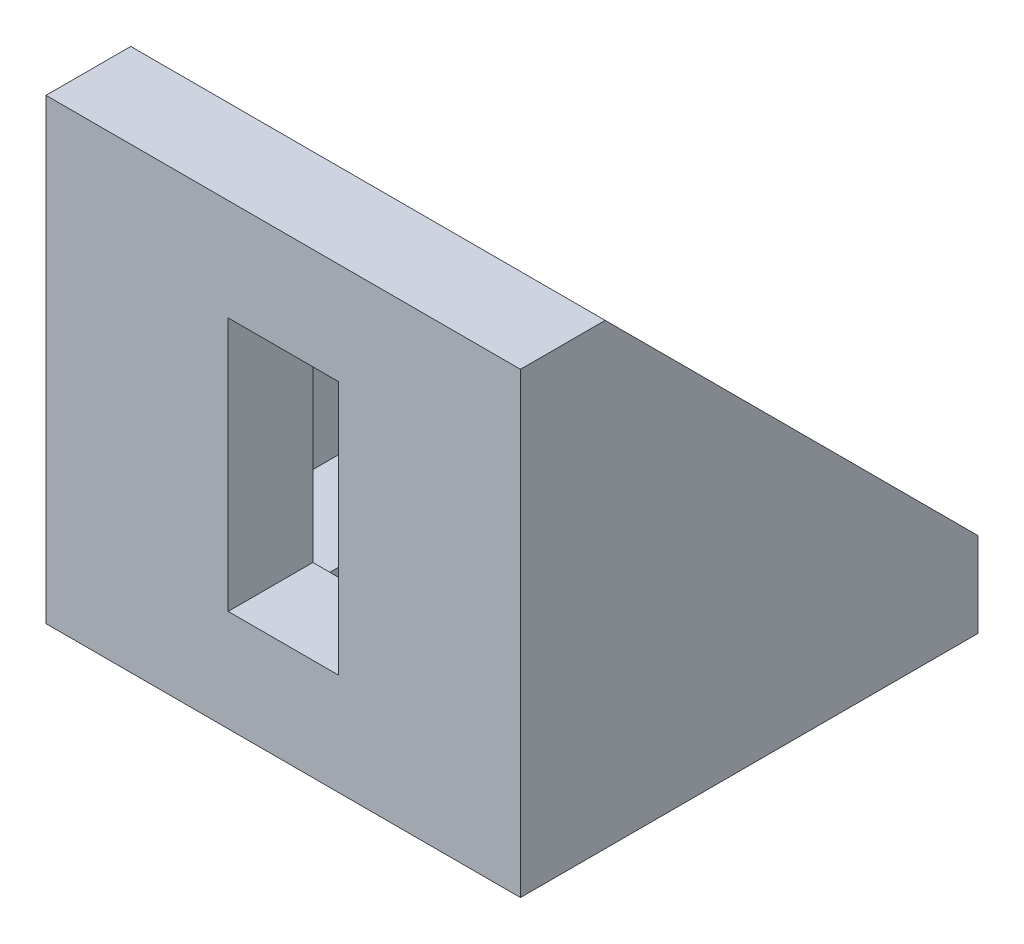
ISO-10303-21;
HEADER;
FILE_DESCRIPTION(('STEP AP214'),'2;1');
FILE_NAME('part.step','',(''),(''),'','','');
FILE_SCHEMA(('AUTOMOTIVE_DESIGN { 1 0 10303 214 1 1 1 1 }'));
ENDSEC;
DATA;
#1=APPLICATION_CONTEXT('core data for automotive mechanical design processes');
#2=APPLICATION_PROTOCOL_DEFINITION('international standard','automotive_design',2000,#1);
#3=PRODUCT_CONTEXT('',#1,'mechanical');
#4=PRODUCT('Part','Part','',(#3));
#5=PRODUCT_RELATED_PRODUCT_CATEGORY('part','',(#4));
#6=PRODUCT_DEFINITION_FORMATION('','',#4);
#7=PRODUCT_DEFINITION_CONTEXT('part definition',#1,'design');
#8=PRODUCT_DEFINITION('design','',#6,#7);
#9=PRODUCT_DEFINITION_SHAPE('','',#8);
#10=(LENGTH_UNIT() NAMED_UNIT(*) SI_UNIT(.MILLI.,.METRE.));
#11=(NAMED_UNIT(*) PLANE_ANGLE_UNIT() SI_UNIT($,.RADIAN.));
#12=(NAMED_UNIT(*) SI_UNIT($,.STERADIAN.) SOLID_ANGLE_UNIT());
#13=UNCERTAINTY_MEASURE_WITH_UNIT(LENGTH_MEASURE(1.E-05),#10,'distance_accuracy_value','');
#14=(GEOMETRIC_REPRESENTATION_CONTEXT(3) GLOBAL_UNCERTAINTY_ASSIGNED_CONTEXT((#13)) GLOBAL_UNIT_ASSIGNED_CONTEXT((#10,
#11,#12)) REPRESENTATION_CONTEXT('',''));
#15=CARTESIAN_POINT('',(0.,0.,0.));
#16=DIRECTION('',(0.,0.,1.));
#17=DIRECTION('',(1.,0.,0.));
#18=AXIS2_PLACEMENT_3D('',#15,#16,#17);
#19=CARTESIAN_POINT('',(9.33333333333333,3.33333333333333,-18.));
#20=DIRECTION('',(0.,-0.707106781186544,0.707106781186551));
#21=DIRECTION('',(0.,-0.707106781186551,-0.707106781186544));
#22=AXIS2_PLACEMENT_3D('',#19,#20,#21);
#23=PLANE('',#22);
#24=DIRECTION('',(-1.,0.,0.));
#25=VECTOR('',#24,1.);
#26=CARTESIAN_POINT('',(9.33333333333333,3.33333333333333,-18.));
#27=LINE('',#26,#25);
#28=CARTESIAN_POINT('',(9.33333333333333,3.33333333333333,-18.));
#29=VERTEX_POINT('',#28);
#30=CARTESIAN_POINT('',(6.,3.33333333333333,-18.));
#31=VERTEX_POINT('',#30);
#32=EDGE_CURVE('E308',#29,#31,#27,.T.);
#33=ORIENTED_EDGE('',*,*,#32,.T.);
#34=DIRECTION('',(0.,0.707106781186551,0.707106781186544));
#35=VECTOR('',#34,1.);
#36=CARTESIAN_POINT('',(6.,3.33333333333333,-18.));
#37=LINE('',#36,#35);
#38=CARTESIAN_POINT('',(6.,18.,-3.33333333333351));
#39=VERTEX_POINT('',#38);
#40=EDGE_CURVE('E320',#31,#39,#37,.T.);
#41=ORIENTED_EDGE('',*,*,#40,.T.);
#42=DIRECTION('',(-1.,0.,0.));
#43=VECTOR('',#42,1.);
#44=CARTESIAN_POINT('',(9.33333333333333,18.,-3.33333333333351));
#45=LINE('',#44,#43);
#46=CARTESIAN_POINT('',(9.33333333333333,18.,-3.33333333333351));
#47=VERTEX_POINT('',#46);
#48=EDGE_CURVE('E228',#47,#39,#45,.T.);
#49=ORIENTED_EDGE('',*,*,#48,.F.);
#50=DIRECTION('',(0.,0.707106781186551,0.707106781186544));
#51=VECTOR('',#50,1.);
#52=CARTESIAN_POINT('',(9.33333333333333,3.33333333333333,-18.));
#53=LINE('',#52,#51);
#54=EDGE_CURVE('E296',#29,#47,#53,.T.);
#55=ORIENTED_EDGE('',*,*,#54,.F.);
#56=EDGE_LOOP('',(#33,#41,#49,#55));
#57=FACE_BOUND('',#56,.T.);
#58=ADVANCED_FACE('F39',(#57),#23,.F.);
#59=CARTESIAN_POINT('',(9.33333333333333,0.,0.));
#60=DIRECTION('',(0.,1.,0.));
#61=DIRECTION('',(0.,0.,1.));
#62=AXIS2_PLACEMENT_3D('',#59,#60,#61);
#63=PLANE('',#62);
#64=DIRECTION('',(-1.,0.,0.));
#65=VECTOR('',#64,1.);
#66=CARTESIAN_POINT('',(2.16666666666667,0.,-4.));
#67=LINE('',#66,#65);
#68=CARTESIAN_POINT('',(2.16666666666667,0.,-4.));
#69=VERTEX_POINT('',#68);
#70=CARTESIAN_POINT('',(-2.16666666666667,0.,-4.));
#71=VERTEX_POINT('',#70);
#72=EDGE_CURVE('E255',#69,#71,#67,.T.);
#73=ORIENTED_EDGE('',*,*,#72,.F.);
#74=DIRECTION('',(0.,0.,1.));
#75=VECTOR('',#74,1.);
#76=CARTESIAN_POINT('',(2.16666666666667,0.,-14.));
#77=LINE('',#76,#75);
#78=CARTESIAN_POINT('',(2.16666666666667,0.,-14.));
#79=VERTEX_POINT('',#78);
#80=EDGE_CURVE('E55',#79,#69,#77,.T.);
#81=ORIENTED_EDGE('',*,*,#80,.F.);
#82=DIRECTION('',(1.,0.,0.));
#83=VECTOR('',#82,1.);
#84=CARTESIAN_POINT('',(2.16666666666667,0.,-14.));
#85=LINE('',#84,#83);
#86=CARTESIAN_POINT('',(-2.16666666666667,0.,-14.));
#87=VERTEX_POINT('',#86);
#88=EDGE_CURVE('E262',#87,#79,#85,.T.);
#89=ORIENTED_EDGE('',*,*,#88,.F.);
#90=DIRECTION('',(0.,0.,-1.));
#91=VECTOR('',#90,1.);
#92=CARTESIAN_POINT('',(-2.16666666666667,0.,-14.));
#93=LINE('',#92,#91);
#94=EDGE_CURVE('E258',#71,#87,#93,.T.);
#95=ORIENTED_EDGE('',*,*,#94,.F.);
#96=EDGE_LOOP('',(#73,#81,#89,#95));
#97=FACE_BOUND('',#96,.T.);
#98=DIRECTION('',(0.,0.,-1.));
#99=VECTOR('',#98,1.);
#100=CARTESIAN_POINT('',(-9.33333333333333,0.,0.));
#101=LINE('',#100,#99);
#102=CARTESIAN_POINT('',(-9.33333333333333,0.,0.));
#103=VERTEX_POINT('',#102);
#104=CARTESIAN_POINT('',(-9.33333333333333,0.,-18.));
#105=VERTEX_POINT('',#104);
#106=EDGE_CURVE('E288',#103,#105,#101,.T.);
#107=ORIENTED_EDGE('',*,*,#106,.T.);
#108=DIRECTION('',(-1.,0.,0.));
#109=VECTOR('',#108,1.);
#110=CARTESIAN_POINT('',(9.33333333333333,0.,-18.));
#111=LINE('',#110,#109);
#112=CARTESIAN_POINT('',(9.33333333333333,0.,-18.));
#113=VERTEX_POINT('',#112);
#114=EDGE_CURVE('E312',#113,#105,#111,.T.);
#115=ORIENTED_EDGE('',*,*,#114,.F.);
#116=DIRECTION('',(0.,0.,-1.));
#117=VECTOR('',#116,1.);
#118=CARTESIAN_POINT('',(9.33333333333333,0.,0.));
#119=LINE('',#118,#117);
#120=CARTESIAN_POINT('',(9.33333333333333,0.,0.));
#121=VERTEX_POINT('',#120);
#122=EDGE_CURVE('E289',#121,#113,#119,.T.);
#123=ORIENTED_EDGE('',*,*,#122,.F.);
#124=DIRECTION('',(-1.,0.,0.));
#125=VECTOR('',#124,1.);
#126=CARTESIAN_POINT('',(9.33333333333333,0.,0.));
#127=LINE('',#126,#125);
#128=EDGE_CURVE('E236',#121,#103,#127,.T.);
#129=ORIENTED_EDGE('',*,*,#128,.T.);
#130=EDGE_LOOP('',(#107,#115,#123,#129));
#131=FACE_BOUND('',#130,.T.);
#132=ADVANCED_FACE('F41',(#97,#131),#63,.F.);
#133=CARTESIAN_POINT('',(9.33333333333333,0.,-18.));
#134=DIRECTION('',(0.,0.,1.));
#135=DIRECTION('',(1.,0.,0.));
#136=AXIS2_PLACEMENT_3D('',#133,#134,#135);
#137=PLANE('',#136);
#138=DIRECTION('',(0.,1.,0.));
#139=VECTOR('',#138,1.);
#140=CARTESIAN_POINT('',(-9.33333333333333,0.,-18.));
#141=LINE('',#140,#139);
#142=CARTESIAN_POINT('',(-9.33333333333333,3.33333333333333,-18.));
#143=VERTEX_POINT('',#142);
#144=EDGE_CURVE('E302',#105,#143,#141,.T.);
#145=ORIENTED_EDGE('',*,*,#144,.T.);
#146=CARTESIAN_POINT('',(-6.,3.33333333333333,-18.));
#147=VERTEX_POINT('',#146);
#148=EDGE_CURVE('E299',#147,#143,#27,.T.);
#149=ORIENTED_EDGE('',*,*,#148,.F.);
#150=DIRECTION('',(1.,0.,0.));
#151=VECTOR('',#150,1.);
#152=CARTESIAN_POINT('',(6.,3.33333333333333,-18.));
#153=LINE('',#152,#151);
#154=EDGE_CURVE('E284',#147,#31,#153,.T.);
#155=ORIENTED_EDGE('',*,*,#154,.T.);
#156=ORIENTED_EDGE('',*,*,#32,.F.);
#157=DIRECTION('',(0.,1.,0.));
#158=VECTOR('',#157,1.);
#159=CARTESIAN_POINT('',(9.33333333333333,0.,-18.));
#160=LINE('',#159,#158);
#161=EDGE_CURVE('E292',#113,#29,#160,.T.);
#162=ORIENTED_EDGE('',*,*,#161,.F.);
#163=ORIENTED_EDGE('',*,*,#114,.T.);
#164=EDGE_LOOP('',(#145,#149,#155,#156,#162,#163));
#165=FACE_BOUND('',#164,.T.);
#166=ADVANCED_FACE('F365',(#165),#137,.F.);
#167=DIRECTION('',(0.,0.707106781186551,0.707106781186544));
#168=VECTOR('',#167,1.);
#169=CARTESIAN_POINT('',(-9.33333333333333,3.33333333333333,-18.));
#170=LINE('',#169,#168);
#171=CARTESIAN_POINT('',(-9.33333333333333,18.,-3.33333333333351));
#172=VERTEX_POINT('',#171);
#173=EDGE_CURVE('E293',#143,#172,#170,.T.);
#174=ORIENTED_EDGE('',*,*,#173,.T.);
#175=CARTESIAN_POINT('',(-6.,18.,-3.33333333333351));
#176=VERTEX_POINT('',#175);
#177=EDGE_CURVE('E221',#176,#172,#45,.T.);
#178=ORIENTED_EDGE('',*,*,#177,.F.);
#179=DIRECTION('',(0.,-0.707106781186551,-0.707106781186544));
#180=VECTOR('',#179,1.);
#181=CARTESIAN_POINT('',(-6.,3.33333333333334,-18.));
#182=LINE('',#181,#180);
#183=EDGE_CURVE('E316',#176,#147,#182,.T.);
#184=ORIENTED_EDGE('',*,*,#183,.T.);
#185=ORIENTED_EDGE('',*,*,#148,.T.);
#186=EDGE_LOOP('',(#174,#178,#184,#185));
#187=FACE_BOUND('',#186,.T.);
#188=ADVANCED_FACE('F361',(#187),#23,.F.);
#189=CARTESIAN_POINT('',(9.33333333333333,0.,0.));
#190=DIRECTION('',(-1.,0.,0.));
#191=DIRECTION('',(0.,0.,1.));
#192=AXIS2_PLACEMENT_3D('',#189,#190,#191);
#193=PLANE('',#192);
#194=ORIENTED_EDGE('',*,*,#54,.T.);
#195=DIRECTION('',(0.,0.,-1.));
#196=VECTOR('',#195,1.);
#197=CARTESIAN_POINT('',(9.33333333333333,18.,-1.7785772854495E-13));
#198=LINE('',#197,#196);
#199=CARTESIAN_POINT('',(9.33333333333333,18.,-1.7785772854495E-13));
#200=VERTEX_POINT('',#199);
#201=EDGE_CURVE('E216',#200,#47,#198,.T.);
#202=ORIENTED_EDGE('',*,*,#201,.F.);
#203=DIRECTION('',(0.,1.,0.));
#204=VECTOR('',#203,1.);
#205=CARTESIAN_POINT('',(9.33333333333333,0.,0.));
#206=LINE('',#205,#204);
#207=EDGE_CURVE('E212',#121,#200,#206,.T.);
#208=ORIENTED_EDGE('',*,*,#207,.F.);
#209=ORIENTED_EDGE('',*,*,#122,.T.);
#210=ORIENTED_EDGE('',*,*,#161,.T.);
#211=EDGE_LOOP('',(#194,#202,#208,#209,#210));
#212=FACE_BOUND('',#211,.T.);
#213=ADVANCED_FACE('F368',(#212),#193,.F.);
#214=CARTESIAN_POINT('',(-9.33333333333333,0.,0.));
#215=DIRECTION('',(-1.,0.,0.));
#216=DIRECTION('',(0.,0.,1.));
#217=AXIS2_PLACEMENT_3D('',#214,#215,#216);
#218=PLANE('',#217);
#219=ORIENTED_EDGE('',*,*,#106,.F.);
#220=DIRECTION('',(0.,1.,0.));
#221=VECTOR('',#220,1.);
#222=CARTESIAN_POINT('',(-9.33333333333333,0.,0.));
#223=LINE('',#222,#221);
#224=CARTESIAN_POINT('',(-9.33333333333333,18.,-1.7785772854495E-13));
#225=VERTEX_POINT('',#224);
#226=EDGE_CURVE('E211',#103,#225,#223,.T.);
#227=ORIENTED_EDGE('',*,*,#226,.T.);
#228=DIRECTION('',(0.,0.,-1.));
#229=VECTOR('',#228,1.);
#230=CARTESIAN_POINT('',(-9.33333333333333,18.,-1.7785772854495E-13));
#231=LINE('',#230,#229);
#232=EDGE_CURVE('E217',#225,#172,#231,.T.);
#233=ORIENTED_EDGE('',*,*,#232,.T.);
#234=ORIENTED_EDGE('',*,*,#173,.F.);
#235=ORIENTED_EDGE('',*,*,#144,.F.);
#236=EDGE_LOOP('',(#219,#227,#233,#234,#235));
#237=FACE_BOUND('',#236,.T.);
#238=ADVANCED_FACE('F374',(#237),#218,.T.);
#239=CARTESIAN_POINT('',(6.,31.3333333333333,-18.));
#240=DIRECTION('',(1.,0.,0.));
#241=DIRECTION('',(0.,0.,-1.));
#242=AXIS2_PLACEMENT_3D('',#239,#240,#241);
#243=PLANE('',#242);
#244=ORIENTED_EDGE('',*,*,#40,.F.);
#245=DIRECTION('',(0.,0.,1.));
#246=VECTOR('',#245,1.);
#247=CARTESIAN_POINT('',(6.,3.33333333333333,-18.));
#248=LINE('',#247,#246);
#249=CARTESIAN_POINT('',(6.,3.3333333333333,-3.33333333333337));
#250=VERTEX_POINT('',#249);
#251=EDGE_CURVE('E270',#31,#250,#248,.T.);
#252=ORIENTED_EDGE('',*,*,#251,.T.);
#253=DIRECTION('',(0.,-1.,0.));
#254=VECTOR('',#253,1.);
#255=CARTESIAN_POINT('',(6.,18.,-3.33333333333351));
#256=LINE('',#255,#254);
#257=EDGE_CURVE('E192',#39,#250,#256,.T.);
#258=ORIENTED_EDGE('',*,*,#257,.F.);
#259=EDGE_LOOP('',(#244,#252,#258));
#260=FACE_BOUND('',#259,.T.);
#261=ADVANCED_FACE('F397',(#260),#243,.F.);
#262=CARTESIAN_POINT('',(-6.,31.3333333333333,-18.));
#263=DIRECTION('',(-1.,0.,0.));
#264=DIRECTION('',(0.,0.,1.));
#265=AXIS2_PLACEMENT_3D('',#262,#263,#264);
#266=PLANE('',#265);
#267=DIRECTION('',(0.,0.,-1.));
#268=VECTOR('',#267,1.);
#269=CARTESIAN_POINT('',(-6.,3.33333333333333,-18.));
#270=LINE('',#269,#268);
#271=CARTESIAN_POINT('',(-6.,3.3333333333333,-3.33333333333337));
#272=VERTEX_POINT('',#271);
#273=EDGE_CURVE('E281',#272,#147,#270,.T.);
#274=ORIENTED_EDGE('',*,*,#273,.T.);
#275=ORIENTED_EDGE('',*,*,#183,.F.);
#276=DIRECTION('',(0.,1.,0.));
#277=VECTOR('',#276,1.);
#278=CARTESIAN_POINT('',(-6.,18.,-3.33333333333351));
#279=LINE('',#278,#277);
#280=EDGE_CURVE('E203',#272,#176,#279,.T.);
#281=ORIENTED_EDGE('',*,*,#280,.F.);
#282=EDGE_LOOP('',(#274,#275,#281));
#283=FACE_BOUND('',#282,.T.);
#284=ADVANCED_FACE('F355',(#283),#266,.F.);
#285=CARTESIAN_POINT('',(0.,3.33333333333333,0.));
#286=DIRECTION('',(0.,-1.,0.));
#287=DIRECTION('',(0.,0.,-1.));
#288=AXIS2_PLACEMENT_3D('',#285,#286,#287);
#289=PLANE('',#288);
#290=DIRECTION('',(1.,0.,0.));
#291=VECTOR('',#290,1.);
#292=CARTESIAN_POINT('',(0.,3.33333333333333,-14.));
#293=LINE('',#292,#291);
#294=CARTESIAN_POINT('',(-2.16666666666667,3.33333333333333,-14.));
#295=VERTEX_POINT('',#294);
#296=CARTESIAN_POINT('',(2.16666666666667,3.33333333333333,-14.));
#297=VERTEX_POINT('',#296);
#298=EDGE_CURVE('E48',#295,#297,#293,.T.);
#299=ORIENTED_EDGE('',*,*,#298,.T.);
#300=DIRECTION('',(0.,0.,1.));
#301=VECTOR('',#300,1.);
#302=CARTESIAN_POINT('',(2.16666666666667,3.33333333333333,0.));
#303=LINE('',#302,#301);
#304=CARTESIAN_POINT('',(2.16666666666667,3.33333333333333,-4.));
#305=VERTEX_POINT('',#304);
#306=EDGE_CURVE('E11',#297,#305,#303,.T.);
#307=ORIENTED_EDGE('',*,*,#306,.T.);
#308=DIRECTION('',(-1.,0.,0.));
#309=VECTOR('',#308,1.);
#310=CARTESIAN_POINT('',(0.,3.33333333333333,-4.));
#311=LINE('',#310,#309);
#312=CARTESIAN_POINT('',(-2.16666666666667,3.33333333333333,-4.));
#313=VERTEX_POINT('',#312);
#314=EDGE_CURVE('E323',#305,#313,#311,.T.);
#315=ORIENTED_EDGE('',*,*,#314,.T.);
#316=DIRECTION('',(0.,0.,-1.));
#317=VECTOR('',#316,1.);
#318=CARTESIAN_POINT('',(-2.16666666666667,3.33333333333333,0.));
#319=LINE('',#318,#317);
#320=EDGE_CURVE('E327',#313,#295,#319,.T.);
#321=ORIENTED_EDGE('',*,*,#320,.T.);
#322=EDGE_LOOP('',(#299,#307,#315,#321));
#323=FACE_BOUND('',#322,.T.);
#324=ORIENTED_EDGE('',*,*,#251,.F.);
#325=ORIENTED_EDGE('',*,*,#154,.F.);
#326=ORIENTED_EDGE('',*,*,#273,.F.);
#327=DIRECTION('',(-1.,0.,0.));
#328=VECTOR('',#327,1.);
#329=CARTESIAN_POINT('',(6.,3.3333333333333,-3.33333333333337));
#330=LINE('',#329,#328);
#331=EDGE_CURVE('E199',#250,#272,#330,.T.);
#332=ORIENTED_EDGE('',*,*,#331,.F.);
#333=EDGE_LOOP('',(#324,#325,#326,#332));
#334=FACE_BOUND('',#333,.T.);
#335=ADVANCED_FACE('F333',(#323,#334),#289,.F.);
#336=CARTESIAN_POINT('',(2.16666666666667,10.6666666666666,-14.));
#337=DIRECTION('',(1.,0.,0.));
#338=DIRECTION('',(0.,0.,-1.));
#339=AXIS2_PLACEMENT_3D('',#336,#337,#338);
#340=PLANE('',#339);
#341=DIRECTION('',(0.,-1.,0.));
#342=VECTOR('',#341,1.);
#343=CARTESIAN_POINT('',(2.16666666666667,10.6666666666666,-14.));
#344=LINE('',#343,#342);
#345=EDGE_CURVE('E267',#297,#79,#344,.T.);
#346=ORIENTED_EDGE('',*,*,#345,.T.);
#347=ORIENTED_EDGE('',*,*,#80,.T.);
#348=DIRECTION('',(0.,-1.,0.));
#349=VECTOR('',#348,1.);
#350=CARTESIAN_POINT('',(2.16666666666667,10.6666666666666,-4.));
#351=LINE('',#350,#349);
#352=EDGE_CURVE('E266',#305,#69,#351,.T.);
#353=ORIENTED_EDGE('',*,*,#352,.F.);
#354=ORIENTED_EDGE('',*,*,#306,.F.);
#355=EDGE_LOOP('',(#346,#347,#353,#354));
#356=FACE_BOUND('',#355,.T.);
#357=ADVANCED_FACE('F347',(#356),#340,.F.);
#358=CARTESIAN_POINT('',(2.16666666666667,10.6666666666666,-14.));
#359=DIRECTION('',(0.,0.,-1.));
#360=DIRECTION('',(-1.,0.,0.));
#361=AXIS2_PLACEMENT_3D('',#358,#359,#360);
#362=PLANE('',#361);
#363=DIRECTION('',(0.,-1.,0.));
#364=VECTOR('',#363,1.);
#365=CARTESIAN_POINT('',(-2.16666666666667,10.6666666666666,-14.));
#366=LINE('',#365,#364);
#367=EDGE_CURVE('E271',#295,#87,#366,.T.);
#368=ORIENTED_EDGE('',*,*,#367,.T.);
#369=ORIENTED_EDGE('',*,*,#88,.T.);
#370=ORIENTED_EDGE('',*,*,#345,.F.);
#371=ORIENTED_EDGE('',*,*,#298,.F.);
#372=EDGE_LOOP('',(#368,#369,#370,#371));
#373=FACE_BOUND('',#372,.T.);
#374=ADVANCED_FACE('F338',(#373),#362,.F.);
#375=CARTESIAN_POINT('',(-2.16666666666667,10.6666666666666,-14.));
#376=DIRECTION('',(-1.,0.,0.));
#377=DIRECTION('',(0.,0.,1.));
#378=AXIS2_PLACEMENT_3D('',#375,#376,#377);
#379=PLANE('',#378);
#380=DIRECTION('',(0.,-1.,0.));
#381=VECTOR('',#380,1.);
#382=CARTESIAN_POINT('',(-2.16666666666667,10.6666666666666,-4.));
#383=LINE('',#382,#381);
#384=EDGE_CURVE('E63',#313,#71,#383,.T.);
#385=ORIENTED_EDGE('',*,*,#384,.T.);
#386=ORIENTED_EDGE('',*,*,#94,.T.);
#387=ORIENTED_EDGE('',*,*,#367,.F.);
#388=ORIENTED_EDGE('',*,*,#320,.F.);
#389=EDGE_LOOP('',(#385,#386,#387,#388));
#390=FACE_BOUND('',#389,.T.);
#391=ADVANCED_FACE('F340',(#390),#379,.F.);
#392=CARTESIAN_POINT('',(2.16666666666667,10.6666666666666,-4.));
#393=DIRECTION('',(0.,0.,1.));
#394=DIRECTION('',(1.,0.,0.));
#395=AXIS2_PLACEMENT_3D('',#392,#393,#394);
#396=PLANE('',#395);
#397=ORIENTED_EDGE('',*,*,#352,.T.);
#398=ORIENTED_EDGE('',*,*,#72,.T.);
#399=ORIENTED_EDGE('',*,*,#384,.F.);
#400=ORIENTED_EDGE('',*,*,#314,.F.);
#401=EDGE_LOOP('',(#397,#398,#399,#400));
#402=FACE_BOUND('',#401,.T.);
#403=ADVANCED_FACE('F346',(#402),#396,.F.);
#404=CARTESIAN_POINT('',(9.33333333333333,0.,0.));
#405=DIRECTION('',(0.,0.,-1.));
#406=DIRECTION('',(0.,-1.,0.));
#407=AXIS2_PLACEMENT_3D('',#404,#405,#406);
#408=PLANE('',#407);
#409=DIRECTION('',(-1.,0.,0.));
#410=VECTOR('',#409,1.);
#411=CARTESIAN_POINT('',(2.16666666666667,4.,0.));
#412=LINE('',#411,#410);
#413=CARTESIAN_POINT('',(2.16666666666667,4.,0.));
#414=VERTEX_POINT('',#413);
#415=CARTESIAN_POINT('',(-2.16666666666667,4.,0.));
#416=VERTEX_POINT('',#415);
#417=EDGE_CURVE('E158',#414,#416,#412,.T.);
#418=ORIENTED_EDGE('',*,*,#417,.T.);
#419=DIRECTION('',(0.,1.,0.));
#420=VECTOR('',#419,1.);
#421=CARTESIAN_POINT('',(-2.16666666666667,14.,-1.38333788868294E-13));
#422=LINE('',#421,#420);
#423=CARTESIAN_POINT('',(-2.16666666666667,14.,-1.38333788868294E-13));
#424=VERTEX_POINT('',#423);
#425=EDGE_CURVE('E169',#416,#424,#422,.T.);
#426=ORIENTED_EDGE('',*,*,#425,.T.);
#427=DIRECTION('',(1.,0.,0.));
#428=VECTOR('',#427,1.);
#429=CARTESIAN_POINT('',(2.16666666666667,14.,-1.38333788868294E-13));
#430=LINE('',#429,#428);
#431=CARTESIAN_POINT('',(2.16666666666667,14.,-1.38333788868294E-13));
#432=VERTEX_POINT('',#431);
#433=EDGE_CURVE('E175',#424,#432,#430,.T.);
#434=ORIENTED_EDGE('',*,*,#433,.T.);
#435=DIRECTION('',(0.,-1.,0.));
#436=VECTOR('',#435,1.);
#437=CARTESIAN_POINT('',(2.16666666666667,14.,-1.38333788868294E-13));
#438=LINE('',#437,#436);
#439=EDGE_CURVE('E181',#432,#414,#438,.T.);
#440=ORIENTED_EDGE('',*,*,#439,.T.);
#441=EDGE_LOOP('',(#418,#426,#434,#440));
#442=FACE_BOUND('',#441,.T.);
#443=ORIENTED_EDGE('',*,*,#226,.F.);
#444=ORIENTED_EDGE('',*,*,#128,.F.);
#445=ORIENTED_EDGE('',*,*,#207,.T.);
#446=DIRECTION('',(-1.,0.,0.));
#447=VECTOR('',#446,1.);
#448=CARTESIAN_POINT('',(9.33333333333333,18.,-1.7785772854495E-13));
#449=LINE('',#448,#447);
#450=EDGE_CURVE('E232',#200,#225,#449,.T.);
#451=ORIENTED_EDGE('',*,*,#450,.T.);
#452=EDGE_LOOP('',(#443,#444,#445,#451));
#453=FACE_BOUND('',#452,.T.);
#454=ADVANCED_FACE('F178',(#442,#453),#408,.F.);
#455=CARTESIAN_POINT('',(9.33333333333333,18.,-1.7785772854495E-13));
#456=DIRECTION('',(0.,-1.,0.));
#457=DIRECTION('',(1.,0.,0.));
#458=AXIS2_PLACEMENT_3D('',#455,#456,#457);
#459=PLANE('',#458);
#460=ORIENTED_EDGE('',*,*,#232,.F.);
#461=ORIENTED_EDGE('',*,*,#450,.F.);
#462=ORIENTED_EDGE('',*,*,#201,.T.);
#463=ORIENTED_EDGE('',*,*,#48,.T.);
#464=DIRECTION('',(1.,0.,0.));
#465=VECTOR('',#464,1.);
#466=CARTESIAN_POINT('',(6.,18.,-3.33333333333351));
#467=LINE('',#466,#465);
#468=EDGE_CURVE('E207',#176,#39,#467,.T.);
#469=ORIENTED_EDGE('',*,*,#468,.F.);
#470=ORIENTED_EDGE('',*,*,#177,.T.);
#471=EDGE_LOOP('',(#460,#461,#462,#463,#469,#470));
#472=FACE_BOUND('',#471,.T.);
#473=ADVANCED_FACE('F386',(#472),#459,.F.);
#474=CARTESIAN_POINT('',(0.,0.,-3.33333333333333));
#475=DIRECTION('',(0.,0.,1.));
#476=DIRECTION('',(0.,1.,0.));
#477=AXIS2_PLACEMENT_3D('',#474,#475,#476);
#478=PLANE('',#477);
#479=DIRECTION('',(1.,0.,0.));
#480=VECTOR('',#479,1.);
#481=CARTESIAN_POINT('',(0.,14.,-3.33333333333347));
#482=LINE('',#481,#480);
#483=CARTESIAN_POINT('',(-2.16666666666667,14.,-3.33333333333347));
#484=VERTEX_POINT('',#483);
#485=CARTESIAN_POINT('',(2.16666666666667,14.,-3.33333333333347));
#486=VERTEX_POINT('',#485);
#487=EDGE_CURVE('E245',#484,#486,#482,.T.);
#488=ORIENTED_EDGE('',*,*,#487,.F.);
#489=DIRECTION('',(0.,1.,0.));
#490=VECTOR('',#489,1.);
#491=CARTESIAN_POINT('',(-2.16666666666667,0.,-3.33333333333333));
#492=LINE('',#491,#490);
#493=CARTESIAN_POINT('',(-2.16666666666667,3.99999999999997,-3.33333333333337));
#494=VERTEX_POINT('',#493);
#495=EDGE_CURVE('E242',#494,#484,#492,.T.);
#496=ORIENTED_EDGE('',*,*,#495,.F.);
#497=DIRECTION('',(-1.,0.,0.));
#498=VECTOR('',#497,1.);
#499=CARTESIAN_POINT('',(0.,3.99999999999997,-3.33333333333337));
#500=LINE('',#499,#498);
#501=CARTESIAN_POINT('',(2.16666666666667,3.99999999999997,-3.33333333333337));
#502=VERTEX_POINT('',#501);
#503=EDGE_CURVE('E160',#502,#494,#500,.T.);
#504=ORIENTED_EDGE('',*,*,#503,.F.);
#505=DIRECTION('',(0.,-1.,0.));
#506=VECTOR('',#505,1.);
#507=CARTESIAN_POINT('',(2.16666666666667,0.,-3.33333333333333));
#508=LINE('',#507,#506);
#509=EDGE_CURVE('E249',#486,#502,#508,.T.);
#510=ORIENTED_EDGE('',*,*,#509,.F.);
#511=EDGE_LOOP('',(#488,#496,#504,#510));
#512=FACE_BOUND('',#511,.T.);
#513=ORIENTED_EDGE('',*,*,#257,.T.);
#514=ORIENTED_EDGE('',*,*,#331,.T.);
#515=ORIENTED_EDGE('',*,*,#280,.T.);
#516=ORIENTED_EDGE('',*,*,#468,.T.);
#517=EDGE_LOOP('',(#513,#514,#515,#516));
#518=FACE_BOUND('',#517,.T.);
#519=ADVANCED_FACE('F400',(#512,#518),#478,.F.);
#520=CARTESIAN_POINT('',(2.16666666666667,13.9999999999999,-10.6666666666668));
#521=DIRECTION('',(1.,0.,0.));
#522=DIRECTION('',(0.,1.,0.));
#523=AXIS2_PLACEMENT_3D('',#520,#521,#522);
#524=PLANE('',#523);
#525=DIRECTION('',(0.,0.,1.));
#526=VECTOR('',#525,1.);
#527=CARTESIAN_POINT('',(2.16666666666667,13.9999999999999,-10.6666666666668));
#528=LINE('',#527,#526);
#529=EDGE_CURVE('E189',#486,#432,#528,.T.);
#530=ORIENTED_EDGE('',*,*,#529,.F.);
#531=ORIENTED_EDGE('',*,*,#509,.T.);
#532=DIRECTION('',(0.,0.,1.));
#533=VECTOR('',#532,1.);
#534=CARTESIAN_POINT('',(2.16666666666667,3.9999999999999,-10.6666666666667));
#535=LINE('',#534,#533);
#536=EDGE_CURVE('E166',#502,#414,#535,.T.);
#537=ORIENTED_EDGE('',*,*,#536,.T.);
#538=ORIENTED_EDGE('',*,*,#439,.F.);
#539=EDGE_LOOP('',(#530,#531,#537,#538));
#540=FACE_BOUND('',#539,.T.);
#541=ADVANCED_FACE('F463',(#540),#524,.F.);
#542=CARTESIAN_POINT('',(2.16666666666667,13.9999999999999,-10.6666666666668));
#543=DIRECTION('',(0.,1.,0.));
#544=DIRECTION('',(-1.,0.,0.));
#545=AXIS2_PLACEMENT_3D('',#542,#543,#544);
#546=PLANE('',#545);
#547=DIRECTION('',(0.,0.,1.));
#548=VECTOR('',#547,1.);
#549=CARTESIAN_POINT('',(-2.16666666666667,13.9999999999999,-10.6666666666668));
#550=LINE('',#549,#548);
#551=EDGE_CURVE('E165',#484,#424,#550,.T.);
#552=ORIENTED_EDGE('',*,*,#551,.F.);
#553=ORIENTED_EDGE('',*,*,#487,.T.);
#554=ORIENTED_EDGE('',*,*,#529,.T.);
#555=ORIENTED_EDGE('',*,*,#433,.F.);
#556=EDGE_LOOP('',(#552,#553,#554,#555));
#557=FACE_BOUND('',#556,.T.);
#558=ADVANCED_FACE('F473',(#557),#546,.F.);
#559=CARTESIAN_POINT('',(-2.16666666666667,13.9999999999999,-10.6666666666668));
#560=DIRECTION('',(-1.,0.,0.));
#561=DIRECTION('',(0.,-1.,0.));
#562=AXIS2_PLACEMENT_3D('',#559,#560,#561);
#563=PLANE('',#562);
#564=DIRECTION('',(0.,0.,1.));
#565=VECTOR('',#564,1.);
#566=CARTESIAN_POINT('',(-2.16666666666667,3.9999999999999,-10.6666666666667));
#567=LINE('',#566,#565);
#568=EDGE_CURVE('E154',#494,#416,#567,.T.);
#569=ORIENTED_EDGE('',*,*,#568,.F.);
#570=ORIENTED_EDGE('',*,*,#495,.T.);
#571=ORIENTED_EDGE('',*,*,#551,.T.);
#572=ORIENTED_EDGE('',*,*,#425,.F.);
#573=EDGE_LOOP('',(#569,#570,#571,#572));
#574=FACE_BOUND('',#573,.T.);
#575=ADVANCED_FACE('F170',(#574),#563,.F.);
#576=CARTESIAN_POINT('',(2.16666666666667,3.9999999999999,-10.6666666666667));
#577=DIRECTION('',(0.,-1.,0.));
#578=DIRECTION('',(1.,0.,0.));
#579=AXIS2_PLACEMENT_3D('',#576,#577,#578);
#580=PLANE('',#579);
#581=ORIENTED_EDGE('',*,*,#536,.F.);
#582=ORIENTED_EDGE('',*,*,#503,.T.);
#583=ORIENTED_EDGE('',*,*,#568,.T.);
#584=ORIENTED_EDGE('',*,*,#417,.F.);
#585=EDGE_LOOP('',(#581,#582,#583,#584));
#586=FACE_BOUND('',#585,.T.);
#587=ADVANCED_FACE('F156',(#586),#580,.F.);
#588=CLOSED_SHELL('',(#58,#132,#166,#188,#213,#238,#261,#284,#335,#357,#374,#391,#403,#454,#473,
#519,#541,#558,#575,#587));
#589=MANIFOLD_SOLID_BREP('B2',#588);
#590=ADVANCED_BREP_SHAPE_REPRESENTATION('',(#18,#589),#14);
#591=SHAPE_DEFINITION_REPRESENTATION(#9,#590);
ENDSEC;
END-ISO-10303-21;
